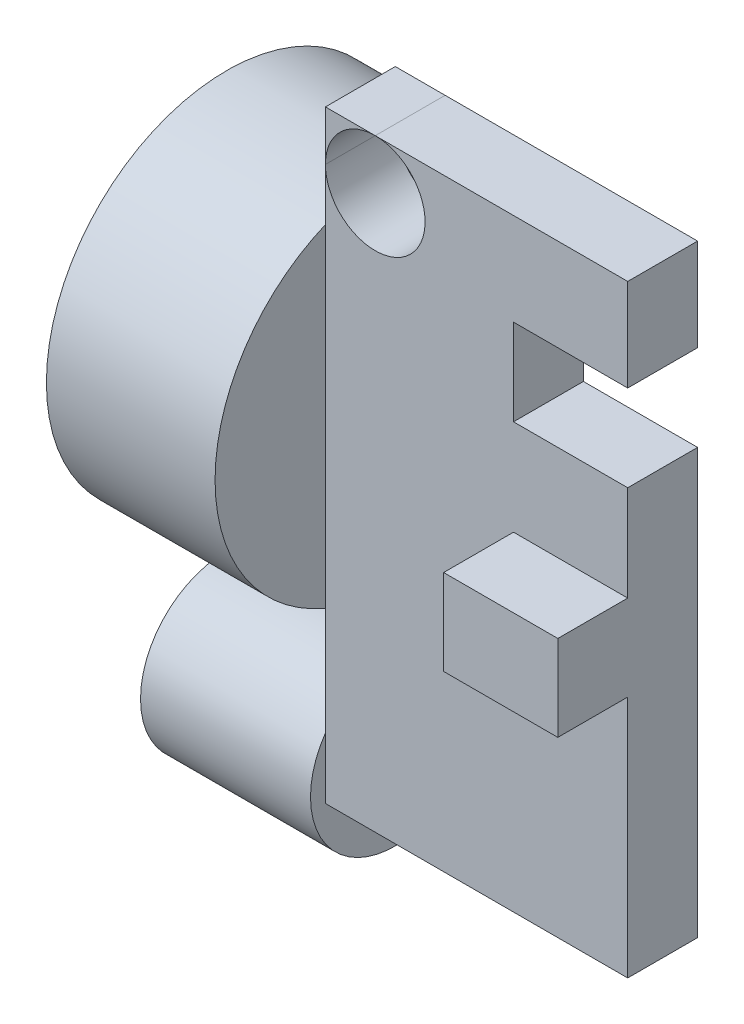
ISO-10303-21;
HEADER;
FILE_DESCRIPTION(('STEP AP214'),'2;1');
FILE_NAME('part.step','',(''),(''),'','','');
FILE_SCHEMA(('AUTOMOTIVE_DESIGN { 1 0 10303 214 1 1 1 1 }'));
ENDSEC;
DATA;
#1=APPLICATION_CONTEXT('core data for automotive mechanical design processes');
#2=APPLICATION_PROTOCOL_DEFINITION('international standard','automotive_design',2000,#1);
#3=PRODUCT_CONTEXT('',#1,'mechanical');
#4=PRODUCT('Part','Part','',(#3));
#5=PRODUCT_RELATED_PRODUCT_CATEGORY('part','',(#4));
#6=PRODUCT_DEFINITION_FORMATION('','',#4);
#7=PRODUCT_DEFINITION_CONTEXT('part definition',#1,'design');
#8=PRODUCT_DEFINITION('design','',#6,#7);
#9=PRODUCT_DEFINITION_SHAPE('','',#8);
#10=(LENGTH_UNIT() NAMED_UNIT(*) SI_UNIT(.MILLI.,.METRE.));
#11=(NAMED_UNIT(*) PLANE_ANGLE_UNIT() SI_UNIT($,.RADIAN.));
#12=(NAMED_UNIT(*) SI_UNIT($,.STERADIAN.) SOLID_ANGLE_UNIT());
#13=UNCERTAINTY_MEASURE_WITH_UNIT(LENGTH_MEASURE(1.E-05),#10,'distance_accuracy_value','');
#14=(GEOMETRIC_REPRESENTATION_CONTEXT(3) GLOBAL_UNCERTAINTY_ASSIGNED_CONTEXT((#13)) GLOBAL_UNIT_ASSIGNED_CONTEXT((#10,
#11,#12)) REPRESENTATION_CONTEXT('',''));
#15=CARTESIAN_POINT('',(0.,0.,0.));
#16=DIRECTION('',(0.,0.,1.));
#17=DIRECTION('',(1.,0.,0.));
#18=AXIS2_PLACEMENT_3D('',#15,#16,#17);
#19=CARTESIAN_POINT('',(0.,0.,10.));
#20=DIRECTION('',(1.,0.,0.));
#21=DIRECTION('',(0.,0.,-1.));
#22=AXIS2_PLACEMENT_3D('',#19,#20,#21);
#23=PLANE('',#22);
#24=DIRECTION('',(0.,0.,1.));
#25=VECTOR('',#24,1.);
#26=CARTESIAN_POINT('',(0.,79.1890477830541,0.));
#27=LINE('',#26,#25);
#28=CARTESIAN_POINT('',(0.,79.1890477830541,0.));
#29=VERTEX_POINT('',#28);
#30=CARTESIAN_POINT('',(0.,79.1890477830541,10.));
#31=VERTEX_POINT('',#30);
#32=EDGE_CURVE('E64',#29,#31,#27,.T.);
#33=ORIENTED_EDGE('',*,*,#32,.F.);
#34=DIRECTION('',(0.,-1.,0.));
#35=VECTOR('',#34,1.);
#36=CARTESIAN_POINT('',(0.,0.,0.));
#37=LINE('',#36,#35);
#38=CARTESIAN_POINT('',(0.,73.7526817744266,0.));
#39=VERTEX_POINT('',#38);
#40=EDGE_CURVE('E235',#29,#39,#37,.T.);
#41=ORIENTED_EDGE('',*,*,#40,.T.);
#42=CARTESIAN_POINT('',(0.,47.9636771291327,0.));
#43=DIRECTION('',(-1.,0.,0.));
#44=DIRECTION('',(0.,0.,1.));
#45=AXIS2_PLACEMENT_3D('',#42,#43,#44);
#46=CIRCLE('',#45,25.7890046452939);
#47=CARTESIAN_POINT('',(0.,71.7349362584887,10.));
#48=VERTEX_POINT('',#47);
#49=EDGE_CURVE('E294',#48,#39,#46,.T.);
#50=ORIENTED_EDGE('',*,*,#49,.F.);
#51=DIRECTION('',(0.,-1.,0.));
#52=VECTOR('',#51,1.);
#53=CARTESIAN_POINT('',(0.,0.,10.));
#54=LINE('',#53,#52);
#55=EDGE_CURVE('E234',#31,#48,#54,.T.);
#56=ORIENTED_EDGE('',*,*,#55,.F.);
#57=EDGE_LOOP('',(#33,#41,#50,#56));
#58=FACE_BOUND('',#57,.T.);
#59=ADVANCED_FACE('F55',(#58),#23,.F.);
#60=CARTESIAN_POINT('',(0.,0.,10.));
#61=DIRECTION('',(0.,0.,-1.));
#62=DIRECTION('',(-1.,0.,0.));
#63=AXIS2_PLACEMENT_3D('',#60,#61,#62);
#64=PLANE('',#63);
#65=DIRECTION('',(-1.,0.,0.));
#66=VECTOR('',#65,1.);
#67=CARTESIAN_POINT('',(0.,86.319685860999,10.));
#68=LINE('',#67,#66);
#69=CARTESIAN_POINT('',(43.2546997281489,86.319685860999,10.));
#70=VERTEX_POINT('',#69);
#71=CARTESIAN_POINT('',(7.13063807794486,86.319685860999,10.));
#72=VERTEX_POINT('',#71);
#73=EDGE_CURVE('E230',#70,#72,#68,.T.);
#74=ORIENTED_EDGE('',*,*,#73,.T.);
#75=CARTESIAN_POINT('',(7.13063807794486,79.1890477830541,10.));
#76=DIRECTION('',(0.,0.,1.));
#77=DIRECTION('',(1.,0.,0.));
#78=AXIS2_PLACEMENT_3D('',#75,#76,#77);
#79=CIRCLE('',#78,7.13063807794486);
#80=EDGE_CURVE('E12',#31,#72,#79,.T.);
#81=ORIENTED_EDGE('',*,*,#80,.F.);
#82=ORIENTED_EDGE('',*,*,#55,.T.);
#83=CARTESIAN_POINT('',(0.,24.1924179997767,10.));
#84=VERTEX_POINT('',#83);
#85=EDGE_CURVE('E238',#48,#84,#54,.T.);
#86=ORIENTED_EDGE('',*,*,#85,.T.);
#87=CARTESIAN_POINT('',(0.,8.7399551113477,10.));
#88=VERTEX_POINT('',#87);
#89=EDGE_CURVE('E239',#84,#88,#54,.T.);
#90=ORIENTED_EDGE('',*,*,#89,.T.);
#91=DIRECTION('',(0.,1.,0.));
#92=VECTOR('',#91,1.);
#93=CARTESIAN_POINT('',(0.,0.,10.));
#94=LINE('',#93,#92);
#95=CARTESIAN_POINT('',(0.,0.,10.));
#96=VERTEX_POINT('',#95);
#97=EDGE_CURVE('E315',#96,#88,#94,.T.);
#98=ORIENTED_EDGE('',*,*,#97,.F.);
#99=DIRECTION('',(1.,0.,0.));
#100=VECTOR('',#99,1.);
#101=CARTESIAN_POINT('',(0.,0.,10.));
#102=LINE('',#101,#100);
#103=CARTESIAN_POINT('',(43.2546997281489,0.,10.));
#104=VERTEX_POINT('',#103);
#105=EDGE_CURVE('E410',#96,#104,#102,.T.);
#106=ORIENTED_EDGE('',*,*,#105,.T.);
#107=DIRECTION('',(0.,1.,0.));
#108=VECTOR('',#107,1.);
#109=CARTESIAN_POINT('',(43.2546997281489,0.,10.));
#110=LINE('',#109,#108);
#111=CARTESIAN_POINT('',(43.2546997281489,34.8172633097861,10.));
#112=VERTEX_POINT('',#111);
#113=EDGE_CURVE('E219',#104,#112,#110,.T.);
#114=ORIENTED_EDGE('',*,*,#113,.T.);
#115=DIRECTION('',(1.,0.,0.));
#116=VECTOR('',#115,1.);
#117=CARTESIAN_POINT('',(0.,34.8172633097861,10.));
#118=LINE('',#117,#116);
#119=CARTESIAN_POINT('',(26.9141252731668,34.8172633097861,10.));
#120=VERTEX_POINT('',#119);
#121=EDGE_CURVE('E195',#120,#112,#118,.T.);
#122=ORIENTED_EDGE('',*,*,#121,.F.);
#123=DIRECTION('',(0.,-1.,0.));
#124=VECTOR('',#123,1.);
#125=CARTESIAN_POINT('',(26.9141252731668,0.,10.));
#126=LINE('',#125,#124);
#127=CARTESIAN_POINT('',(26.9141252731668,47.077183702621,10.));
#128=VERTEX_POINT('',#127);
#129=EDGE_CURVE('E193',#128,#120,#126,.T.);
#130=ORIENTED_EDGE('',*,*,#129,.F.);
#131=DIRECTION('',(1.,0.,0.));
#132=VECTOR('',#131,1.);
#133=CARTESIAN_POINT('',(0.,47.077183702621,10.));
#134=LINE('',#133,#132);
#135=CARTESIAN_POINT('',(43.2546997281489,47.077183702621,10.));
#136=VERTEX_POINT('',#135);
#137=EDGE_CURVE('E215',#128,#136,#134,.T.);
#138=ORIENTED_EDGE('',*,*,#137,.T.);
#139=CARTESIAN_POINT('',(43.2546997281489,60.7517102946292,10.));
#140=VERTEX_POINT('',#139);
#141=EDGE_CURVE('E218',#136,#140,#110,.T.);
#142=ORIENTED_EDGE('',*,*,#141,.T.);
#143=DIRECTION('',(1.,0.,0.));
#144=VECTOR('',#143,1.);
#145=CARTESIAN_POINT('',(0.,60.7517102946292,10.));
#146=LINE('',#145,#144);
#147=CARTESIAN_POINT('',(26.9141252731668,60.7517102946292,10.));
#148=VERTEX_POINT('',#147);
#149=EDGE_CURVE('E335',#148,#140,#146,.T.);
#150=ORIENTED_EDGE('',*,*,#149,.F.);
#151=DIRECTION('',(0.,-1.,0.));
#152=VECTOR('',#151,1.);
#153=CARTESIAN_POINT('',(26.9141252731668,0.,10.));
#154=LINE('',#153,#152);
#155=CARTESIAN_POINT('',(26.9141252731668,73.1059377674091,10.));
#156=VERTEX_POINT('',#155);
#157=EDGE_CURVE('E344',#156,#148,#154,.T.);
#158=ORIENTED_EDGE('',*,*,#157,.F.);
#159=DIRECTION('',(1.,0.,0.));
#160=VECTOR('',#159,1.);
#161=CARTESIAN_POINT('',(0.,73.1059377674091,10.));
#162=LINE('',#161,#160);
#163=CARTESIAN_POINT('',(43.2546997281489,73.1059377674091,10.));
#164=VERTEX_POINT('',#163);
#165=EDGE_CURVE('E265',#156,#164,#162,.T.);
#166=ORIENTED_EDGE('',*,*,#165,.T.);
#167=EDGE_CURVE('E256',#164,#70,#110,.T.);
#168=ORIENTED_EDGE('',*,*,#167,.T.);
#169=EDGE_LOOP('',(#74,#81,#82,#86,#90,#98,#106,#114,#122,#130,#138,#142,#150,#158,#166,#168));
#170=FACE_BOUND('',#169,.T.);
#171=ADVANCED_FACE('F366',(#170),#64,.F.);
#172=CARTESIAN_POINT('',(43.2546997281489,0.,10.));
#173=DIRECTION('',(-1.,0.,0.));
#174=DIRECTION('',(0.,0.,1.));
#175=AXIS2_PLACEMENT_3D('',#172,#173,#174);
#176=PLANE('',#175);
#177=DIRECTION('',(0.,0.,1.));
#178=VECTOR('',#177,1.);
#179=CARTESIAN_POINT('',(43.2546997281489,73.1059377674091,0.));
#180=LINE('',#179,#178);
#181=CARTESIAN_POINT('',(43.2546997281489,73.1059377674091,0.));
#182=VERTEX_POINT('',#181);
#183=EDGE_CURVE('E337',#182,#164,#180,.T.);
#184=ORIENTED_EDGE('',*,*,#183,.F.);
#185=DIRECTION('',(0.,1.,0.));
#186=VECTOR('',#185,1.);
#187=CARTESIAN_POINT('',(43.2546997281489,0.,0.));
#188=LINE('',#187,#186);
#189=CARTESIAN_POINT('',(43.2546997281489,86.319685860999,0.));
#190=VERTEX_POINT('',#189);
#191=EDGE_CURVE('E248',#182,#190,#188,.T.);
#192=ORIENTED_EDGE('',*,*,#191,.T.);
#193=DIRECTION('',(0.,0.,-1.));
#194=VECTOR('',#193,1.);
#195=CARTESIAN_POINT('',(43.2546997281489,86.319685860999,10.));
#196=LINE('',#195,#194);
#197=EDGE_CURVE('E228',#70,#190,#196,.T.);
#198=ORIENTED_EDGE('',*,*,#197,.F.);
#199=ORIENTED_EDGE('',*,*,#167,.F.);
#200=EDGE_LOOP('',(#184,#192,#198,#199));
#201=FACE_BOUND('',#200,.T.);
#202=ADVANCED_FACE('F361',(#201),#176,.F.);
#203=CARTESIAN_POINT('',(0.,0.,0.));
#204=DIRECTION('',(0.,0.,-1.));
#205=DIRECTION('',(-1.,0.,0.));
#206=AXIS2_PLACEMENT_3D('',#203,#204,#205);
#207=PLANE('',#206);
#208=CARTESIAN_POINT('',(7.13063807794486,79.1890477830541,0.));
#209=DIRECTION('',(0.,0.,1.));
#210=DIRECTION('',(1.,0.,0.));
#211=AXIS2_PLACEMENT_3D('',#208,#209,#210);
#212=CIRCLE('',#211,7.13063807794486);
#213=CARTESIAN_POINT('',(7.13063807794486,86.319685860999,0.));
#214=VERTEX_POINT('',#213);
#215=EDGE_CURVE('E71',#29,#214,#212,.T.);
#216=ORIENTED_EDGE('',*,*,#215,.T.);
#217=DIRECTION('',(-1.,0.,0.));
#218=VECTOR('',#217,1.);
#219=CARTESIAN_POINT('',(0.,86.319685860999,0.));
#220=LINE('',#219,#218);
#221=EDGE_CURVE('E229',#190,#214,#220,.T.);
#222=ORIENTED_EDGE('',*,*,#221,.F.);
#223=ORIENTED_EDGE('',*,*,#191,.F.);
#224=DIRECTION('',(1.,0.,0.));
#225=VECTOR('',#224,1.);
#226=CARTESIAN_POINT('',(0.,73.1059377674091,0.));
#227=LINE('',#226,#225);
#228=CARTESIAN_POINT('',(26.9141252731668,73.1059377674091,0.));
#229=VERTEX_POINT('',#228);
#230=EDGE_CURVE('E340',#229,#182,#227,.T.);
#231=ORIENTED_EDGE('',*,*,#230,.F.);
#232=DIRECTION('',(0.,-1.,0.));
#233=VECTOR('',#232,1.);
#234=CARTESIAN_POINT('',(26.9141252731668,0.,0.));
#235=LINE('',#234,#233);
#236=CARTESIAN_POINT('',(26.9141252731668,60.7517102946292,0.));
#237=VERTEX_POINT('',#236);
#238=EDGE_CURVE('E204',#229,#237,#235,.T.);
#239=ORIENTED_EDGE('',*,*,#238,.T.);
#240=DIRECTION('',(1.,0.,0.));
#241=VECTOR('',#240,1.);
#242=CARTESIAN_POINT('',(0.,60.7517102946292,0.));
#243=LINE('',#242,#241);
#244=CARTESIAN_POINT('',(43.2546997281489,60.7517102946292,0.));
#245=VERTEX_POINT('',#244);
#246=EDGE_CURVE('E255',#237,#245,#243,.T.);
#247=ORIENTED_EDGE('',*,*,#246,.T.);
#248=CARTESIAN_POINT('',(43.2546997281489,0.,0.));
#249=VERTEX_POINT('',#248);
#250=EDGE_CURVE('E258',#249,#245,#188,.T.);
#251=ORIENTED_EDGE('',*,*,#250,.F.);
#252=DIRECTION('',(1.,0.,0.));
#253=VECTOR('',#252,1.);
#254=CARTESIAN_POINT('',(0.,0.,0.));
#255=LINE('',#254,#253);
#256=CARTESIAN_POINT('',(0.,0.,0.));
#257=VERTEX_POINT('',#256);
#258=EDGE_CURVE('E279',#257,#249,#255,.T.);
#259=ORIENTED_EDGE('',*,*,#258,.F.);
#260=CARTESIAN_POINT('',(0.,13.9997265668665,0.));
#261=VERTEX_POINT('',#260);
#262=EDGE_CURVE('E245',#261,#257,#37,.T.);
#263=ORIENTED_EDGE('',*,*,#262,.F.);
#264=CARTESIAN_POINT('',(0.,22.1746724838388,0.));
#265=VERTEX_POINT('',#264);
#266=EDGE_CURVE('E286',#265,#261,#37,.T.);
#267=ORIENTED_EDGE('',*,*,#266,.F.);
#268=EDGE_CURVE('E244',#39,#265,#37,.T.);
#269=ORIENTED_EDGE('',*,*,#268,.F.);
#270=ORIENTED_EDGE('',*,*,#40,.F.);
#271=EDGE_LOOP('',(#216,#222,#223,#231,#239,#247,#251,#259,#263,#267,#269,#270));
#272=FACE_BOUND('',#271,.T.);
#273=ADVANCED_FACE('F362',(#272),#207,.T.);
#274=CARTESIAN_POINT('',(0.,1.86372438084582,0.));
#275=DIRECTION('',(-1.,0.,0.));
#276=DIRECTION('',(0.,0.,1.));
#277=AXIS2_PLACEMENT_3D('',#274,#275,#276);
#278=CIRCLE('',#277,12.1360021860207);
#279=EDGE_CURVE('E320',#88,#261,#278,.T.);
#280=ORIENTED_EDGE('',*,*,#279,.F.);
#281=ORIENTED_EDGE('',*,*,#89,.F.);
#282=EDGE_CURVE('E304',#265,#84,#46,.T.);
#283=ORIENTED_EDGE('',*,*,#282,.F.);
#284=ORIENTED_EDGE('',*,*,#266,.T.);
#285=EDGE_LOOP('',(#280,#281,#283,#284));
#286=FACE_BOUND('',#285,.T.);
#287=ADVANCED_FACE('F391',(#286),#23,.F.);
#288=CARTESIAN_POINT('',(0.,0.,10.));
#289=DIRECTION('',(0.,1.,0.));
#290=DIRECTION('',(0.,0.,1.));
#291=AXIS2_PLACEMENT_3D('',#288,#289,#290);
#292=PLANE('',#291);
#293=ORIENTED_EDGE('',*,*,#258,.T.);
#294=DIRECTION('',(0.,0.,-1.));
#295=VECTOR('',#294,1.);
#296=CARTESIAN_POINT('',(43.2546997281489,0.,10.));
#297=LINE('',#296,#295);
#298=EDGE_CURVE('E208',#104,#249,#297,.T.);
#299=ORIENTED_EDGE('',*,*,#298,.F.);
#300=ORIENTED_EDGE('',*,*,#105,.F.);
#301=DIRECTION('',(0.,0.,-1.));
#302=VECTOR('',#301,1.);
#303=CARTESIAN_POINT('',(0.,0.,10.));
#304=LINE('',#303,#302);
#305=EDGE_CURVE('E271',#96,#257,#304,.T.);
#306=ORIENTED_EDGE('',*,*,#305,.T.);
#307=EDGE_LOOP('',(#293,#299,#300,#306));
#308=FACE_BOUND('',#307,.T.);
#309=ADVANCED_FACE('F398',(#308),#292,.F.);
#310=ORIENTED_EDGE('',*,*,#250,.T.);
#311=DIRECTION('',(0.,0.,1.));
#312=VECTOR('',#311,1.);
#313=CARTESIAN_POINT('',(43.2546997281489,60.7517102946292,0.));
#314=LINE('',#313,#312);
#315=EDGE_CURVE('E209',#245,#140,#314,.T.);
#316=ORIENTED_EDGE('',*,*,#315,.T.);
#317=ORIENTED_EDGE('',*,*,#141,.F.);
#318=DIRECTION('',(0.,0.,-1.));
#319=VECTOR('',#318,1.);
#320=CARTESIAN_POINT('',(43.2546997281489,47.077183702621,20.));
#321=LINE('',#320,#319);
#322=CARTESIAN_POINT('',(43.2546997281489,47.077183702621,20.));
#323=VERTEX_POINT('',#322);
#324=EDGE_CURVE('E190',#323,#136,#321,.T.);
#325=ORIENTED_EDGE('',*,*,#324,.F.);
#326=DIRECTION('',(0.,1.,0.));
#327=VECTOR('',#326,1.);
#328=CARTESIAN_POINT('',(43.2546997281489,0.,20.));
#329=LINE('',#328,#327);
#330=CARTESIAN_POINT('',(43.2546997281489,34.8172633097861,20.));
#331=VERTEX_POINT('',#330);
#332=EDGE_CURVE('E179',#331,#323,#329,.T.);
#333=ORIENTED_EDGE('',*,*,#332,.F.);
#334=DIRECTION('',(0.,0.,-1.));
#335=VECTOR('',#334,1.);
#336=CARTESIAN_POINT('',(43.2546997281489,34.8172633097861,20.));
#337=LINE('',#336,#335);
#338=EDGE_CURVE('E175',#331,#112,#337,.T.);
#339=ORIENTED_EDGE('',*,*,#338,.T.);
#340=ORIENTED_EDGE('',*,*,#113,.F.);
#341=ORIENTED_EDGE('',*,*,#298,.T.);
#342=EDGE_LOOP('',(#310,#316,#317,#325,#333,#339,#340,#341));
#343=FACE_BOUND('',#342,.T.);
#344=ADVANCED_FACE('F374',(#343),#176,.F.);
#345=CARTESIAN_POINT('',(0.,86.319685860999,10.));
#346=DIRECTION('',(0.,-1.,0.));
#347=DIRECTION('',(0.,0.,-1.));
#348=AXIS2_PLACEMENT_3D('',#345,#346,#347);
#349=PLANE('',#348);
#350=ORIENTED_EDGE('',*,*,#221,.T.);
#351=DIRECTION('',(0.,0.,1.));
#352=VECTOR('',#351,1.);
#353=CARTESIAN_POINT('',(7.13063807794486,86.319685860999,0.));
#354=LINE('',#353,#352);
#355=EDGE_CURVE('E76',#214,#72,#354,.T.);
#356=ORIENTED_EDGE('',*,*,#355,.T.);
#357=ORIENTED_EDGE('',*,*,#73,.F.);
#358=ORIENTED_EDGE('',*,*,#197,.T.);
#359=EDGE_LOOP('',(#350,#356,#357,#358));
#360=FACE_BOUND('',#359,.T.);
#361=ADVANCED_FACE('F363',(#360),#349,.F.);
#362=CARTESIAN_POINT('',(0.,73.7526817744266,0.));
#363=DIRECTION('',(-1.,0.,0.));
#364=DIRECTION('',(0.,0.,1.));
#365=AXIS2_PLACEMENT_3D('',#362,#363,#364);
#366=PLANE('',#365);
#367=EDGE_CURVE('E301',#39,#265,#46,.T.);
#368=ORIENTED_EDGE('',*,*,#367,.F.);
#369=ORIENTED_EDGE('',*,*,#268,.T.);
#370=EDGE_LOOP('',(#368,#369));
#371=FACE_BOUND('',#370,.T.);
#372=ADVANCED_FACE('F417',(#371),#366,.F.);
#373=ORIENTED_EDGE('',*,*,#85,.F.);
#374=EDGE_CURVE('E303',#84,#48,#46,.T.);
#375=ORIENTED_EDGE('',*,*,#374,.F.);
#376=EDGE_LOOP('',(#373,#375));
#377=FACE_BOUND('',#376,.T.);
#378=ADVANCED_FACE('F426',(#377),#366,.F.);
#379=CARTESIAN_POINT('',(-24.1354917123785,47.9636771291327,0.));
#380=DIRECTION('',(-1.,0.,0.));
#381=DIRECTION('',(0.,0.,1.));
#382=AXIS2_PLACEMENT_3D('',#379,#380,#381);
#383=CYLINDRICAL_SURFACE('',#382,25.7890046452939);
#384=CARTESIAN_POINT('',(-24.1354917123785,47.9636771291327,0.));
#385=DIRECTION('',(-1.,0.,0.));
#386=DIRECTION('',(0.,0.,1.));
#387=AXIS2_PLACEMENT_3D('',#384,#385,#386);
#388=CIRCLE('',#387,25.7890046452939);
#389=CARTESIAN_POINT('',(-24.1354917123785,47.9636771291327,25.7890046452939));
#390=VERTEX_POINT('',#389);
#391=EDGE_CURVE('E323',#390,#390,#388,.T.);
#392=ORIENTED_EDGE('',*,*,#391,.F.);
#393=EDGE_LOOP('',(#392));
#394=FACE_BOUND('',#393,.T.);
#395=ORIENTED_EDGE('',*,*,#49,.T.);
#396=ORIENTED_EDGE('',*,*,#367,.T.);
#397=ORIENTED_EDGE('',*,*,#282,.T.);
#398=ORIENTED_EDGE('',*,*,#374,.T.);
#399=EDGE_LOOP('',(#395,#396,#397,#398));
#400=FACE_BOUND('',#399,.T.);
#401=ADVANCED_FACE('F423',(#394,#400),#383,.T.);
#402=CARTESIAN_POINT('',(-24.1354917123785,73.7526817744266,0.));
#403=DIRECTION('',(1.,0.,0.));
#404=DIRECTION('',(0.,0.,-1.));
#405=AXIS2_PLACEMENT_3D('',#402,#403,#404);
#406=PLANE('',#405);
#407=ORIENTED_EDGE('',*,*,#391,.T.);
#408=EDGE_LOOP('',(#407));
#409=FACE_BOUND('',#408,.T.);
#410=ADVANCED_FACE('F435',(#409),#406,.F.);
#411=CARTESIAN_POINT('',(0.,13.9997265668665,0.));
#412=DIRECTION('',(-1.,0.,0.));
#413=DIRECTION('',(0.,0.,1.));
#414=AXIS2_PLACEMENT_3D('',#411,#412,#413);
#415=PLANE('',#414);
#416=ORIENTED_EDGE('',*,*,#305,.F.);
#417=ORIENTED_EDGE('',*,*,#97,.T.);
#418=EDGE_CURVE('E333',#261,#88,#278,.T.);
#419=ORIENTED_EDGE('',*,*,#418,.F.);
#420=ORIENTED_EDGE('',*,*,#262,.T.);
#421=EDGE_LOOP('',(#416,#417,#419,#420));
#422=FACE_BOUND('',#421,.T.);
#423=ADVANCED_FACE('F442',(#422),#415,.F.);
#424=CARTESIAN_POINT('',(-24.3200687614225,13.9997265668665,0.));
#425=DIRECTION('',(1.,0.,0.));
#426=DIRECTION('',(0.,0.,-1.));
#427=AXIS2_PLACEMENT_3D('',#424,#425,#426);
#428=PLANE('',#427);
#429=CARTESIAN_POINT('',(-24.3200687614225,1.86372438084582,0.));
#430=DIRECTION('',(-1.,0.,0.));
#431=DIRECTION('',(0.,0.,1.));
#432=AXIS2_PLACEMENT_3D('',#429,#430,#431);
#433=CIRCLE('',#432,12.1360021860207);
#434=CARTESIAN_POINT('',(-24.3200687614225,1.86372438084582,12.1360021860207));
#435=VERTEX_POINT('',#434);
#436=EDGE_CURVE('E314',#435,#435,#433,.T.);
#437=ORIENTED_EDGE('',*,*,#436,.T.);
#438=EDGE_LOOP('',(#437));
#439=FACE_BOUND('',#438,.T.);
#440=ADVANCED_FACE('F444',(#439),#428,.F.);
#441=CARTESIAN_POINT('',(-24.3200687614225,1.86372438084582,0.));
#442=DIRECTION('',(-1.,0.,0.));
#443=DIRECTION('',(0.,0.,1.));
#444=AXIS2_PLACEMENT_3D('',#441,#442,#443);
#445=CYLINDRICAL_SURFACE('',#444,12.1360021860207);
#446=ORIENTED_EDGE('',*,*,#436,.F.);
#447=EDGE_LOOP('',(#446));
#448=FACE_BOUND('',#447,.T.);
#449=ORIENTED_EDGE('',*,*,#279,.T.);
#450=ORIENTED_EDGE('',*,*,#418,.T.);
#451=EDGE_LOOP('',(#449,#450));
#452=FACE_BOUND('',#451,.T.);
#453=ADVANCED_FACE('F447',(#448,#452),#445,.T.);
#454=CARTESIAN_POINT('',(26.9141252731668,0.,0.));
#455=DIRECTION('',(-1.,0.,0.));
#456=DIRECTION('',(0.,0.,1.));
#457=AXIS2_PLACEMENT_3D('',#454,#455,#456);
#458=PLANE('',#457);
#459=ORIENTED_EDGE('',*,*,#157,.T.);
#460=DIRECTION('',(0.,0.,1.));
#461=VECTOR('',#460,1.);
#462=CARTESIAN_POINT('',(26.9141252731668,60.7517102946292,0.));
#463=LINE('',#462,#461);
#464=EDGE_CURVE('E222',#237,#148,#463,.T.);
#465=ORIENTED_EDGE('',*,*,#464,.F.);
#466=ORIENTED_EDGE('',*,*,#238,.F.);
#467=DIRECTION('',(0.,0.,1.));
#468=VECTOR('',#467,1.);
#469=CARTESIAN_POINT('',(26.9141252731668,73.1059377674091,0.));
#470=LINE('',#469,#468);
#471=EDGE_CURVE('E341',#229,#156,#470,.T.);
#472=ORIENTED_EDGE('',*,*,#471,.T.);
#473=EDGE_LOOP('',(#459,#465,#466,#472));
#474=FACE_BOUND('',#473,.T.);
#475=ADVANCED_FACE('F370',(#474),#458,.F.);
#476=CARTESIAN_POINT('',(0.,73.1059377674091,0.));
#477=DIRECTION('',(0.,-1.,0.));
#478=DIRECTION('',(0.,0.,-1.));
#479=AXIS2_PLACEMENT_3D('',#476,#477,#478);
#480=PLANE('',#479);
#481=ORIENTED_EDGE('',*,*,#165,.F.);
#482=ORIENTED_EDGE('',*,*,#471,.F.);
#483=ORIENTED_EDGE('',*,*,#230,.T.);
#484=ORIENTED_EDGE('',*,*,#183,.T.);
#485=EDGE_LOOP('',(#481,#482,#483,#484));
#486=FACE_BOUND('',#485,.T.);
#487=ADVANCED_FACE('F358',(#486),#480,.T.);
#488=CARTESIAN_POINT('',(0.,60.7517102946292,0.));
#489=DIRECTION('',(0.,-1.,0.));
#490=DIRECTION('',(0.,0.,-1.));
#491=AXIS2_PLACEMENT_3D('',#488,#489,#490);
#492=PLANE('',#491);
#493=ORIENTED_EDGE('',*,*,#149,.T.);
#494=ORIENTED_EDGE('',*,*,#315,.F.);
#495=ORIENTED_EDGE('',*,*,#246,.F.);
#496=ORIENTED_EDGE('',*,*,#464,.T.);
#497=EDGE_LOOP('',(#493,#494,#495,#496));
#498=FACE_BOUND('',#497,.T.);
#499=ADVANCED_FACE('F373',(#498),#492,.F.);
#500=CARTESIAN_POINT('',(26.9141252731668,0.,20.));
#501=DIRECTION('',(1.,0.,0.));
#502=DIRECTION('',(0.,0.,-1.));
#503=AXIS2_PLACEMENT_3D('',#500,#501,#502);
#504=PLANE('',#503);
#505=ORIENTED_EDGE('',*,*,#129,.T.);
#506=DIRECTION('',(0.,0.,-1.));
#507=VECTOR('',#506,1.);
#508=CARTESIAN_POINT('',(26.9141252731668,34.8172633097861,20.));
#509=LINE('',#508,#507);
#510=CARTESIAN_POINT('',(26.9141252731668,34.8172633097861,20.));
#511=VERTEX_POINT('',#510);
#512=EDGE_CURVE('E172',#511,#120,#509,.T.);
#513=ORIENTED_EDGE('',*,*,#512,.F.);
#514=DIRECTION('',(0.,-1.,0.));
#515=VECTOR('',#514,1.);
#516=CARTESIAN_POINT('',(26.9141252731668,0.,20.));
#517=LINE('',#516,#515);
#518=CARTESIAN_POINT('',(26.9141252731668,47.077183702621,20.));
#519=VERTEX_POINT('',#518);
#520=EDGE_CURVE('E180',#519,#511,#517,.T.);
#521=ORIENTED_EDGE('',*,*,#520,.F.);
#522=DIRECTION('',(0.,0.,-1.));
#523=VECTOR('',#522,1.);
#524=CARTESIAN_POINT('',(26.9141252731668,47.077183702621,20.));
#525=LINE('',#524,#523);
#526=EDGE_CURVE('E200',#519,#128,#525,.T.);
#527=ORIENTED_EDGE('',*,*,#526,.T.);
#528=EDGE_LOOP('',(#505,#513,#521,#527));
#529=FACE_BOUND('',#528,.T.);
#530=ADVANCED_FACE('F192',(#529),#504,.F.);
#531=CARTESIAN_POINT('',(0.,34.8172633097861,20.));
#532=DIRECTION('',(0.,1.,0.));
#533=DIRECTION('',(0.,0.,1.));
#534=AXIS2_PLACEMENT_3D('',#531,#532,#533);
#535=PLANE('',#534);
#536=ORIENTED_EDGE('',*,*,#121,.T.);
#537=ORIENTED_EDGE('',*,*,#338,.F.);
#538=DIRECTION('',(1.,0.,0.));
#539=VECTOR('',#538,1.);
#540=CARTESIAN_POINT('',(0.,34.8172633097861,20.));
#541=LINE('',#540,#539);
#542=EDGE_CURVE('E167',#511,#331,#541,.T.);
#543=ORIENTED_EDGE('',*,*,#542,.F.);
#544=ORIENTED_EDGE('',*,*,#512,.T.);
#545=EDGE_LOOP('',(#536,#537,#543,#544));
#546=FACE_BOUND('',#545,.T.);
#547=ADVANCED_FACE('F170',(#546),#535,.F.);
#548=CARTESIAN_POINT('',(0.,47.077183702621,20.));
#549=DIRECTION('',(0.,1.,0.));
#550=DIRECTION('',(0.,0.,1.));
#551=AXIS2_PLACEMENT_3D('',#548,#549,#550);
#552=PLANE('',#551);
#553=ORIENTED_EDGE('',*,*,#137,.F.);
#554=ORIENTED_EDGE('',*,*,#526,.F.);
#555=DIRECTION('',(1.,0.,0.));
#556=VECTOR('',#555,1.);
#557=CARTESIAN_POINT('',(0.,47.077183702621,20.));
#558=LINE('',#557,#556);
#559=EDGE_CURVE('E186',#519,#323,#558,.T.);
#560=ORIENTED_EDGE('',*,*,#559,.T.);
#561=ORIENTED_EDGE('',*,*,#324,.T.);
#562=EDGE_LOOP('',(#553,#554,#560,#561));
#563=FACE_BOUND('',#562,.T.);
#564=ADVANCED_FACE('F379',(#563),#552,.T.);
#565=CARTESIAN_POINT('',(0.,0.,20.));
#566=DIRECTION('',(0.,0.,1.));
#567=DIRECTION('',(1.,0.,0.));
#568=AXIS2_PLACEMENT_3D('',#565,#566,#567);
#569=PLANE('',#568);
#570=ORIENTED_EDGE('',*,*,#520,.T.);
#571=ORIENTED_EDGE('',*,*,#542,.T.);
#572=ORIENTED_EDGE('',*,*,#332,.T.);
#573=ORIENTED_EDGE('',*,*,#559,.F.);
#574=EDGE_LOOP('',(#570,#571,#572,#573));
#575=FACE_BOUND('',#574,.T.);
#576=ADVANCED_FACE('F184',(#575),#569,.T.);
#577=CARTESIAN_POINT('',(7.13063807794486,79.1890477830541,0.));
#578=DIRECTION('',(0.,0.,1.));
#579=DIRECTION('',(1.,0.,0.));
#580=AXIS2_PLACEMENT_3D('',#577,#578,#579);
#581=CYLINDRICAL_SURFACE('',#580,7.13063807794486);
#582=ORIENTED_EDGE('',*,*,#32,.T.);
#583=ORIENTED_EDGE('',*,*,#80,.T.);
#584=ORIENTED_EDGE('',*,*,#355,.F.);
#585=ORIENTED_EDGE('',*,*,#215,.F.);
#586=EDGE_LOOP('',(#582,#583,#584,#585));
#587=FACE_BOUND('',#586,.T.);
#588=ADVANCED_FACE('F57',(#587),#581,.F.);
#589=CLOSED_SHELL('',(#59,#171,#202,#273,#287,#309,#344,#361,#372,#378,#401,#410,#423,#440,#453,
#475,#487,#499,#530,#547,#564,#576,#588));
#590=MANIFOLD_SOLID_BREP('B2',#589);
#591=CARTESIAN_POINT('',(0.,86.319685860999,10.));
#592=DIRECTION('',(0.,-1.,0.));
#593=DIRECTION('',(0.,0.,-1.));
#594=AXIS2_PLACEMENT_3D('',#591,#592,#593);
#595=PLANE('',#594);
#596=DIRECTION('',(0.,0.,1.));
#597=VECTOR('',#596,1.);
#598=CARTESIAN_POINT('',(7.13063807794486,86.319685860999,0.));
#599=LINE('',#598,#597);
#600=CARTESIAN_POINT('',(7.13063807794486,86.319685860999,0.));
#601=VERTEX_POINT('',#600);
#602=CARTESIAN_POINT('',(7.13063807794486,86.319685860999,10.));
#603=VERTEX_POINT('',#602);
#604=EDGE_CURVE('E53',#601,#603,#599,.T.);
#605=ORIENTED_EDGE('',*,*,#604,.F.);
#606=DIRECTION('',(-1.,0.,0.));
#607=VECTOR('',#606,1.);
#608=CARTESIAN_POINT('',(0.,86.319685860999,0.));
#609=LINE('',#608,#607);
#610=CARTESIAN_POINT('',(0.,86.319685860999,0.));
#611=VERTEX_POINT('',#610);
#612=EDGE_CURVE('E700',#601,#611,#609,.T.);
#613=ORIENTED_EDGE('',*,*,#612,.T.);
#614=DIRECTION('',(0.,0.,-1.));
#615=VECTOR('',#614,1.);
#616=CARTESIAN_POINT('',(0.,86.319685860999,10.));
#617=LINE('',#616,#615);
#618=CARTESIAN_POINT('',(0.,86.319685860999,10.));
#619=VERTEX_POINT('',#618);
#620=EDGE_CURVE('E661',#619,#611,#617,.T.);
#621=ORIENTED_EDGE('',*,*,#620,.F.);
#622=DIRECTION('',(-1.,0.,0.));
#623=VECTOR('',#622,1.);
#624=CARTESIAN_POINT('',(0.,86.319685860999,10.));
#625=LINE('',#624,#623);
#626=EDGE_CURVE('E698',#603,#619,#625,.T.);
#627=ORIENTED_EDGE('',*,*,#626,.F.);
#628=EDGE_LOOP('',(#605,#613,#621,#627));
#629=FACE_BOUND('',#628,.T.);
#630=ADVANCED_FACE('F653',(#629),#595,.F.);
#631=CARTESIAN_POINT('',(0.,0.,10.));
#632=DIRECTION('',(1.,0.,0.));
#633=DIRECTION('',(0.,0.,-1.));
#634=AXIS2_PLACEMENT_3D('',#631,#632,#633);
#635=PLANE('',#634);
#636=DIRECTION('',(0.,-1.,0.));
#637=VECTOR('',#636,1.);
#638=CARTESIAN_POINT('',(0.,0.,0.));
#639=LINE('',#638,#637);
#640=CARTESIAN_POINT('',(0.,79.1890477830541,0.));
#641=VERTEX_POINT('',#640);
#642=EDGE_CURVE('E694',#611,#641,#639,.T.);
#643=ORIENTED_EDGE('',*,*,#642,.T.);
#644=DIRECTION('',(0.,0.,1.));
#645=VECTOR('',#644,1.);
#646=CARTESIAN_POINT('',(0.,79.1890477830541,0.));
#647=LINE('',#646,#645);
#648=CARTESIAN_POINT('',(0.,79.1890477830541,10.));
#649=VERTEX_POINT('',#648);
#650=EDGE_CURVE('E668',#641,#649,#647,.T.);
#651=ORIENTED_EDGE('',*,*,#650,.T.);
#652=DIRECTION('',(0.,-1.,0.));
#653=VECTOR('',#652,1.);
#654=CARTESIAN_POINT('',(0.,0.,10.));
#655=LINE('',#654,#653);
#656=EDGE_CURVE('E692',#619,#649,#655,.T.);
#657=ORIENTED_EDGE('',*,*,#656,.F.);
#658=ORIENTED_EDGE('',*,*,#620,.T.);
#659=EDGE_LOOP('',(#643,#651,#657,#658));
#660=FACE_BOUND('',#659,.T.);
#661=ADVANCED_FACE('F655',(#660),#635,.F.);
#662=CARTESIAN_POINT('',(0.,0.,0.));
#663=DIRECTION('',(0.,0.,-1.));
#664=DIRECTION('',(-1.,0.,0.));
#665=AXIS2_PLACEMENT_3D('',#662,#663,#664);
#666=PLANE('',#665);
#667=CARTESIAN_POINT('',(7.13063807794486,79.1890477830541,0.));
#668=DIRECTION('',(0.,0.,1.));
#669=DIRECTION('',(1.,0.,0.));
#670=AXIS2_PLACEMENT_3D('',#667,#668,#669);
#671=CIRCLE('',#670,7.13063807794486);
#672=EDGE_CURVE('E687',#601,#641,#671,.T.);
#673=ORIENTED_EDGE('',*,*,#672,.T.);
#674=ORIENTED_EDGE('',*,*,#642,.F.);
#675=ORIENTED_EDGE('',*,*,#612,.F.);
#676=EDGE_LOOP('',(#673,#674,#675));
#677=FACE_BOUND('',#676,.T.);
#678=ADVANCED_FACE('F708',(#677),#666,.T.);
#679=CARTESIAN_POINT('',(0.,0.,10.));
#680=DIRECTION('',(0.,0.,-1.));
#681=DIRECTION('',(-1.,0.,0.));
#682=AXIS2_PLACEMENT_3D('',#679,#680,#681);
#683=PLANE('',#682);
#684=ORIENTED_EDGE('',*,*,#656,.T.);
#685=CARTESIAN_POINT('',(7.13063807794486,79.1890477830541,10.));
#686=DIRECTION('',(0.,0.,1.));
#687=DIRECTION('',(1.,0.,0.));
#688=AXIS2_PLACEMENT_3D('',#685,#686,#687);
#689=CIRCLE('',#688,7.13063807794486);
#690=EDGE_CURVE('E683',#603,#649,#689,.T.);
#691=ORIENTED_EDGE('',*,*,#690,.F.);
#692=ORIENTED_EDGE('',*,*,#626,.T.);
#693=EDGE_LOOP('',(#684,#691,#692));
#694=FACE_BOUND('',#693,.T.);
#695=ADVANCED_FACE('F697',(#694),#683,.F.);
#696=CARTESIAN_POINT('',(7.13063807794486,79.1890477830541,0.));
#697=DIRECTION('',(0.,0.,1.));
#698=DIRECTION('',(1.,0.,0.));
#699=AXIS2_PLACEMENT_3D('',#696,#697,#698);
#700=CYLINDRICAL_SURFACE('',#699,7.13063807794486);
#701=ORIENTED_EDGE('',*,*,#672,.F.);
#702=ORIENTED_EDGE('',*,*,#604,.T.);
#703=ORIENTED_EDGE('',*,*,#690,.T.);
#704=ORIENTED_EDGE('',*,*,#650,.F.);
#705=EDGE_LOOP('',(#701,#702,#703,#704));
#706=FACE_BOUND('',#705,.T.);
#707=ADVANCED_FACE('F684',(#706),#700,.F.);
#708=CLOSED_SHELL('',(#630,#661,#678,#695,#707));
#709=MANIFOLD_SOLID_BREP('B6',#708);
#710=ADVANCED_BREP_SHAPE_REPRESENTATION('',(#18,#590,#709),#14);
#711=SHAPE_DEFINITION_REPRESENTATION(#9,#710);
ENDSEC;
END-ISO-10303-21;
